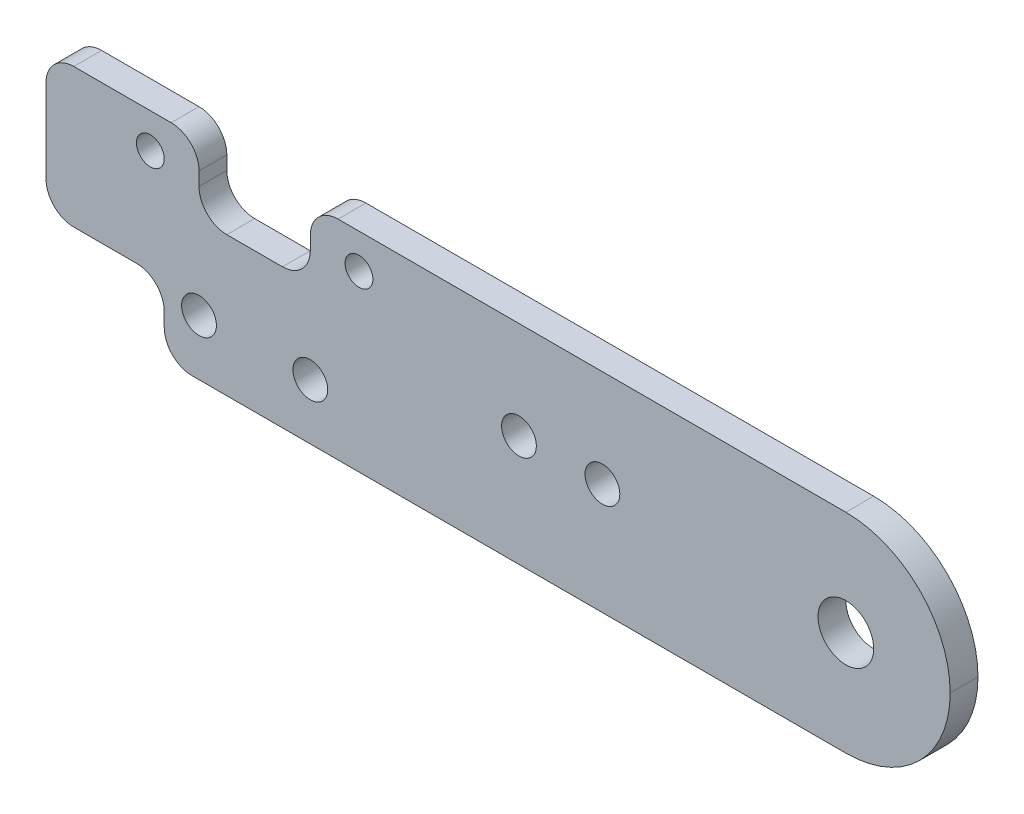
ISO-10303-21;
HEADER;
FILE_DESCRIPTION(('STEP AP214'),'2;1');
FILE_NAME('part.step','',(''),(''),'','','');
FILE_SCHEMA(('AUTOMOTIVE_DESIGN { 1 0 10303 214 1 1 1 1 }'));
ENDSEC;
DATA;
#1=APPLICATION_CONTEXT('core data for automotive mechanical design processes');
#2=APPLICATION_PROTOCOL_DEFINITION('international standard','automotive_design',2000,#1);
#3=PRODUCT_CONTEXT('',#1,'mechanical');
#4=PRODUCT('Part','Part','',(#3));
#5=PRODUCT_RELATED_PRODUCT_CATEGORY('part','',(#4));
#6=PRODUCT_DEFINITION_FORMATION('','',#4);
#7=PRODUCT_DEFINITION_CONTEXT('part definition',#1,'design');
#8=PRODUCT_DEFINITION('design','',#6,#7);
#9=PRODUCT_DEFINITION_SHAPE('','',#8);
#10=(LENGTH_UNIT() NAMED_UNIT(*) SI_UNIT(.MILLI.,.METRE.));
#11=(NAMED_UNIT(*) PLANE_ANGLE_UNIT() SI_UNIT($,.RADIAN.));
#12=(NAMED_UNIT(*) SI_UNIT($,.STERADIAN.) SOLID_ANGLE_UNIT());
#13=UNCERTAINTY_MEASURE_WITH_UNIT(LENGTH_MEASURE(1.E-05),#10,'distance_accuracy_value','');
#14=(GEOMETRIC_REPRESENTATION_CONTEXT(3) GLOBAL_UNCERTAINTY_ASSIGNED_CONTEXT((#13)) GLOBAL_UNIT_ASSIGNED_CONTEXT((#10,
#11,#12)) REPRESENTATION_CONTEXT('',''));
#15=CARTESIAN_POINT('',(0.,0.,0.));
#16=DIRECTION('',(0.,0.,1.));
#17=DIRECTION('',(1.,0.,0.));
#18=AXIS2_PLACEMENT_3D('',#15,#16,#17);
#19=CARTESIAN_POINT('',(-32.5,7.5,2.));
#20=DIRECTION('',(0.,-1.,0.));
#21=DIRECTION('',(0.,0.,-1.));
#22=AXIS2_PLACEMENT_3D('',#19,#20,#21);
#23=PLANE('',#22);
#24=DIRECTION('',(-1.,0.,0.));
#25=VECTOR('',#24,1.);
#26=CARTESIAN_POINT('',(-32.5,7.5,2.));
#27=LINE('',#26,#25);
#28=CARTESIAN_POINT('',(-23.5,7.5,2.));
#29=VERTEX_POINT('',#28);
#30=CARTESIAN_POINT('',(-30.5,7.5,2.));
#31=VERTEX_POINT('',#30);
#32=EDGE_CURVE('E203',#29,#31,#27,.T.);
#33=ORIENTED_EDGE('',*,*,#32,.F.);
#34=DIRECTION('',(0.,0.,1.));
#35=VECTOR('',#34,1.);
#36=CARTESIAN_POINT('',(-23.5,7.5,2.));
#37=LINE('',#36,#35);
#38=CARTESIAN_POINT('',(-23.5,7.5,0.));
#39=VERTEX_POINT('',#38);
#40=EDGE_CURVE('E297',#29,#39,#37,.F.);
#41=ORIENTED_EDGE('',*,*,#40,.T.);
#42=DIRECTION('',(-1.,0.,0.));
#43=VECTOR('',#42,1.);
#44=CARTESIAN_POINT('',(-32.5,7.5,0.));
#45=LINE('',#44,#43);
#46=CARTESIAN_POINT('',(-30.5,7.5,0.));
#47=VERTEX_POINT('',#46);
#48=EDGE_CURVE('E194',#39,#47,#45,.T.);
#49=ORIENTED_EDGE('',*,*,#48,.T.);
#50=DIRECTION('',(0.,0.,-1.));
#51=VECTOR('',#50,1.);
#52=CARTESIAN_POINT('',(-30.5,7.5,2.));
#53=LINE('',#52,#51);
#54=EDGE_CURVE('E295',#47,#31,#53,.F.);
#55=ORIENTED_EDGE('',*,*,#54,.T.);
#56=EDGE_LOOP('',(#33,#41,#49,#55));
#57=FACE_BOUND('',#56,.T.);
#58=ADVANCED_FACE('F36',(#57),#23,.F.);
#59=CARTESIAN_POINT('',(25.,7.5,0.));
#60=VERTEX_POINT('',#59);
#61=CARTESIAN_POINT('',(-11.5,7.5,0.));
#62=VERTEX_POINT('',#61);
#63=EDGE_CURVE('E184',#60,#62,#45,.T.);
#64=ORIENTED_EDGE('',*,*,#63,.T.);
#65=DIRECTION('',(0.,0.,1.));
#66=VECTOR('',#65,1.);
#67=CARTESIAN_POINT('',(-11.5,7.5,2.));
#68=LINE('',#67,#66);
#69=CARTESIAN_POINT('',(-11.5,7.5,2.));
#70=VERTEX_POINT('',#69);
#71=EDGE_CURVE('E288',#62,#70,#68,.T.);
#72=ORIENTED_EDGE('',*,*,#71,.T.);
#73=CARTESIAN_POINT('',(25.,7.5,2.));
#74=VERTEX_POINT('',#73);
#75=EDGE_CURVE('E187',#74,#70,#27,.T.);
#76=ORIENTED_EDGE('',*,*,#75,.F.);
#77=DIRECTION('',(0.,0.,-1.));
#78=VECTOR('',#77,1.);
#79=CARTESIAN_POINT('',(25.,7.5,2.));
#80=LINE('',#79,#78);
#81=EDGE_CURVE('E172',#74,#60,#80,.T.);
#82=ORIENTED_EDGE('',*,*,#81,.T.);
#83=EDGE_LOOP('',(#64,#72,#76,#82));
#84=FACE_BOUND('',#83,.T.);
#85=ADVANCED_FACE('F182',(#84),#23,.F.);
#86=CARTESIAN_POINT('',(-32.5,-7.5,2.));
#87=DIRECTION('',(1.,0.,0.));
#88=DIRECTION('',(0.,0.,-1.));
#89=AXIS2_PLACEMENT_3D('',#86,#87,#88);
#90=PLANE('',#89);
#91=DIRECTION('',(0.,-1.,0.));
#92=VECTOR('',#91,1.);
#93=CARTESIAN_POINT('',(-32.5,-7.5,0.));
#94=LINE('',#93,#92);
#95=CARTESIAN_POINT('',(-32.5,5.5,0.));
#96=VERTEX_POINT('',#95);
#97=CARTESIAN_POINT('',(-32.5,-0.5,0.));
#98=VERTEX_POINT('',#97);
#99=EDGE_CURVE('E193',#96,#98,#94,.T.);
#100=ORIENTED_EDGE('',*,*,#99,.T.);
#101=DIRECTION('',(0.,0.,1.));
#102=VECTOR('',#101,1.);
#103=CARTESIAN_POINT('',(-32.5,-0.5,2.));
#104=LINE('',#103,#102);
#105=CARTESIAN_POINT('',(-32.5,-0.5,2.));
#106=VERTEX_POINT('',#105);
#107=EDGE_CURVE('E275',#98,#106,#104,.T.);
#108=ORIENTED_EDGE('',*,*,#107,.T.);
#109=DIRECTION('',(0.,-1.,0.));
#110=VECTOR('',#109,1.);
#111=CARTESIAN_POINT('',(-32.5,-7.5,2.));
#112=LINE('',#111,#110);
#113=CARTESIAN_POINT('',(-32.5,5.5,2.));
#114=VERTEX_POINT('',#113);
#115=EDGE_CURVE('E362',#114,#106,#112,.T.);
#116=ORIENTED_EDGE('',*,*,#115,.F.);
#117=DIRECTION('',(0.,0.,-1.));
#118=VECTOR('',#117,1.);
#119=CARTESIAN_POINT('',(-32.5,5.5,2.));
#120=LINE('',#119,#118);
#121=EDGE_CURVE('E272',#114,#96,#120,.T.);
#122=ORIENTED_EDGE('',*,*,#121,.T.);
#123=EDGE_LOOP('',(#100,#108,#116,#122));
#124=FACE_BOUND('',#123,.T.);
#125=ADVANCED_FACE('F406',(#124),#90,.F.);
#126=CARTESIAN_POINT('',(-32.5,-7.5,2.));
#127=DIRECTION('',(0.,1.,0.));
#128=DIRECTION('',(0.,0.,1.));
#129=AXIS2_PLACEMENT_3D('',#126,#127,#128);
#130=PLANE('',#129);
#131=DIRECTION('',(1.,0.,0.));
#132=VECTOR('',#131,1.);
#133=CARTESIAN_POINT('',(-32.5,-7.5,2.));
#134=LINE('',#133,#132);
#135=CARTESIAN_POINT('',(-22.,-7.5,2.));
#136=VERTEX_POINT('',#135);
#137=CARTESIAN_POINT('',(25.,-7.5,2.));
#138=VERTEX_POINT('',#137);
#139=EDGE_CURVE('E188',#136,#138,#134,.T.);
#140=ORIENTED_EDGE('',*,*,#139,.F.);
#141=DIRECTION('',(0.,0.,1.));
#142=VECTOR('',#141,1.);
#143=CARTESIAN_POINT('',(-22.,-7.5,2.));
#144=LINE('',#143,#142);
#145=CARTESIAN_POINT('',(-22.,-7.5,0.));
#146=VERTEX_POINT('',#145);
#147=EDGE_CURVE('E261',#136,#146,#144,.F.);
#148=ORIENTED_EDGE('',*,*,#147,.T.);
#149=DIRECTION('',(1.,0.,0.));
#150=VECTOR('',#149,1.);
#151=CARTESIAN_POINT('',(-32.5,-7.5,0.));
#152=LINE('',#151,#150);
#153=CARTESIAN_POINT('',(25.,-7.5,0.));
#154=VERTEX_POINT('',#153);
#155=EDGE_CURVE('E197',#146,#154,#152,.T.);
#156=ORIENTED_EDGE('',*,*,#155,.T.);
#157=DIRECTION('',(0.,0.,-1.));
#158=VECTOR('',#157,1.);
#159=CARTESIAN_POINT('',(25.,-7.5,2.));
#160=LINE('',#159,#158);
#161=EDGE_CURVE('E209',#154,#138,#160,.F.);
#162=ORIENTED_EDGE('',*,*,#161,.T.);
#163=EDGE_LOOP('',(#140,#148,#156,#162));
#164=FACE_BOUND('',#163,.T.);
#165=ADVANCED_FACE('F370',(#164),#130,.F.);
#166=CARTESIAN_POINT('',(0.,0.,2.));
#167=DIRECTION('',(0.,0.,-1.));
#168=DIRECTION('',(-1.,0.,0.));
#169=AXIS2_PLACEMENT_3D('',#166,#167,#168);
#170=PLANE('',#169);
#171=CARTESIAN_POINT('',(1.50000000000001,0.5,2.));
#172=DIRECTION('',(0.,0.,1.));
#173=DIRECTION('',(1.,0.,0.));
#174=AXIS2_PLACEMENT_3D('',#171,#172,#173);
#175=CIRCLE('',#174,1.25);
#176=CARTESIAN_POINT('',(2.75000000000001,0.5,2.));
#177=VERTEX_POINT('',#176);
#178=EDGE_CURVE('E233',#177,#177,#175,.T.);
#179=ORIENTED_EDGE('',*,*,#178,.F.);
#180=EDGE_LOOP('',(#179));
#181=FACE_BOUND('',#180,.T.);
#182=CARTESIAN_POINT('',(7.50000000000001,0.5,2.));
#183=DIRECTION('',(0.,0.,1.));
#184=DIRECTION('',(1.,0.,0.));
#185=AXIS2_PLACEMENT_3D('',#182,#183,#184);
#186=CIRCLE('',#185,1.25);
#187=CARTESIAN_POINT('',(8.75000000000001,0.5,2.));
#188=VERTEX_POINT('',#187);
#189=EDGE_CURVE('E229',#188,#188,#186,.T.);
#190=ORIENTED_EDGE('',*,*,#189,.F.);
#191=EDGE_LOOP('',(#190));
#192=FACE_BOUND('',#191,.T.);
#193=CARTESIAN_POINT('',(-13.5,-3.5,2.));
#194=DIRECTION('',(0.,0.,-1.));
#195=DIRECTION('',(-1.,0.,0.));
#196=AXIS2_PLACEMENT_3D('',#193,#194,#195);
#197=CIRCLE('',#196,1.25);
#198=CARTESIAN_POINT('',(-14.75,-3.5,2.));
#199=VERTEX_POINT('',#198);
#200=EDGE_CURVE('E346',#199,#199,#197,.T.);
#201=ORIENTED_EDGE('',*,*,#200,.T.);
#202=EDGE_LOOP('',(#201));
#203=FACE_BOUND('',#202,.T.);
#204=CARTESIAN_POINT('',(-21.5,-3.5,2.));
#205=DIRECTION('',(0.,0.,-1.));
#206=DIRECTION('',(-1.,0.,0.));
#207=AXIS2_PLACEMENT_3D('',#204,#205,#206);
#208=CIRCLE('',#207,1.25);
#209=CARTESIAN_POINT('',(-22.75,-3.5,2.));
#210=VERTEX_POINT('',#209);
#211=EDGE_CURVE('E352',#210,#210,#208,.T.);
#212=ORIENTED_EDGE('',*,*,#211,.T.);
#213=EDGE_LOOP('',(#212));
#214=FACE_BOUND('',#213,.T.);
#215=CARTESIAN_POINT('',(-25.,5.,2.));
#216=DIRECTION('',(0.,0.,1.));
#217=DIRECTION('',(1.,0.,0.));
#218=AXIS2_PLACEMENT_3D('',#215,#216,#217);
#219=CIRCLE('',#218,0.999999999999998);
#220=CARTESIAN_POINT('',(-24.,5.,2.));
#221=VERTEX_POINT('',#220);
#222=EDGE_CURVE('E222',#221,#221,#219,.T.);
#223=ORIENTED_EDGE('',*,*,#222,.F.);
#224=EDGE_LOOP('',(#223));
#225=FACE_BOUND('',#224,.T.);
#226=CARTESIAN_POINT('',(-9.99999999999999,5.,2.));
#227=DIRECTION('',(0.,0.,1.));
#228=DIRECTION('',(1.,0.,0.));
#229=AXIS2_PLACEMENT_3D('',#226,#227,#228);
#230=CIRCLE('',#229,1.);
#231=CARTESIAN_POINT('',(-9.,5.,2.));
#232=VERTEX_POINT('',#231);
#233=EDGE_CURVE('E355',#232,#232,#230,.T.);
#234=ORIENTED_EDGE('',*,*,#233,.F.);
#235=EDGE_LOOP('',(#234));
#236=FACE_BOUND('',#235,.T.);
#237=CARTESIAN_POINT('',(25.,0.,2.));
#238=DIRECTION('',(0.,0.,1.));
#239=DIRECTION('',(1.,0.,0.));
#240=AXIS2_PLACEMENT_3D('',#237,#238,#239);
#241=CIRCLE('',#240,2.);
#242=CARTESIAN_POINT('',(27.,0.,2.));
#243=VERTEX_POINT('',#242);
#244=EDGE_CURVE('E217',#243,#243,#241,.T.);
#245=ORIENTED_EDGE('',*,*,#244,.F.);
#246=EDGE_LOOP('',(#245));
#247=FACE_BOUND('',#246,.T.);
#248=DIRECTION('',(0.,1.,0.));
#249=VECTOR('',#248,1.);
#250=CARTESIAN_POINT('',(-24.,-7.5,2.));
#251=LINE('',#250,#249);
#252=CARTESIAN_POINT('',(-24.,-5.5,2.));
#253=VERTEX_POINT('',#252);
#254=CARTESIAN_POINT('',(-24.,-4.5,2.));
#255=VERTEX_POINT('',#254);
#256=EDGE_CURVE('E382',#253,#255,#251,.T.);
#257=ORIENTED_EDGE('',*,*,#256,.F.);
#258=CARTESIAN_POINT('',(-22.,-5.5,2.));
#259=DIRECTION('',(0.,0.,-1.));
#260=DIRECTION('',(-1.,0.,0.));
#261=AXIS2_PLACEMENT_3D('',#258,#259,#260);
#262=CIRCLE('',#261,2.);
#263=EDGE_CURVE('E259',#253,#136,#262,.F.);
#264=ORIENTED_EDGE('',*,*,#263,.T.);
#265=ORIENTED_EDGE('',*,*,#139,.T.);
#266=CARTESIAN_POINT('',(25.,0.,2.));
#267=DIRECTION('',(0.,0.,-1.));
#268=DIRECTION('',(-1.,0.,0.));
#269=AXIS2_PLACEMENT_3D('',#266,#267,#268);
#270=CIRCLE('',#269,7.5);
#271=CARTESIAN_POINT('',(32.5,0.,2.));
#272=VERTEX_POINT('',#271);
#273=EDGE_CURVE('E177',#138,#272,#270,.F.);
#274=ORIENTED_EDGE('',*,*,#273,.T.);
#275=CARTESIAN_POINT('',(25.,0.,2.));
#276=DIRECTION('',(0.,0.,-1.));
#277=DIRECTION('',(-1.,0.,0.));
#278=AXIS2_PLACEMENT_3D('',#275,#276,#277);
#279=CIRCLE('',#278,7.5);
#280=EDGE_CURVE('E207',#272,#74,#279,.F.);
#281=ORIENTED_EDGE('',*,*,#280,.T.);
#282=ORIENTED_EDGE('',*,*,#75,.T.);
#283=CARTESIAN_POINT('',(-11.5,5.5,2.));
#284=DIRECTION('',(0.,0.,-1.));
#285=DIRECTION('',(-1.,0.,0.));
#286=AXIS2_PLACEMENT_3D('',#283,#284,#285);
#287=CIRCLE('',#286,2.);
#288=CARTESIAN_POINT('',(-13.5,5.5,2.));
#289=VERTEX_POINT('',#288);
#290=EDGE_CURVE('E255',#70,#289,#287,.F.);
#291=ORIENTED_EDGE('',*,*,#290,.T.);
#292=DIRECTION('',(0.,1.,0.));
#293=VECTOR('',#292,1.);
#294=CARTESIAN_POINT('',(-13.5,7.5,2.));
#295=LINE('',#294,#293);
#296=CARTESIAN_POINT('',(-13.5,4.52974123754762,2.));
#297=VERTEX_POINT('',#296);
#298=EDGE_CURVE('E335',#297,#289,#295,.T.);
#299=ORIENTED_EDGE('',*,*,#298,.F.);
#300=CARTESIAN_POINT('',(-15.5,4.52974123754762,2.));
#301=DIRECTION('',(0.,0.,-1.));
#302=DIRECTION('',(-1.,0.,0.));
#303=AXIS2_PLACEMENT_3D('',#300,#301,#302);
#304=CIRCLE('',#303,2.);
#305=CARTESIAN_POINT('',(-15.5,2.52974123754762,2.));
#306=VERTEX_POINT('',#305);
#307=EDGE_CURVE('E303',#297,#306,#304,.T.);
#308=ORIENTED_EDGE('',*,*,#307,.T.);
#309=DIRECTION('',(1.,0.,0.));
#310=VECTOR('',#309,1.);
#311=CARTESIAN_POINT('',(-21.5,2.52974123754762,2.));
#312=LINE('',#311,#310);
#313=CARTESIAN_POINT('',(-19.5,2.52974123754762,2.));
#314=VERTEX_POINT('',#313);
#315=EDGE_CURVE('E313',#314,#306,#312,.T.);
#316=ORIENTED_EDGE('',*,*,#315,.F.);
#317=CARTESIAN_POINT('',(-19.5,4.52974123754762,2.));
#318=DIRECTION('',(0.,0.,-1.));
#319=DIRECTION('',(-1.,0.,0.));
#320=AXIS2_PLACEMENT_3D('',#317,#318,#319);
#321=CIRCLE('',#320,2.);
#322=CARTESIAN_POINT('',(-21.5,4.52974123754762,2.));
#323=VERTEX_POINT('',#322);
#324=EDGE_CURVE('E44',#314,#323,#321,.T.);
#325=ORIENTED_EDGE('',*,*,#324,.T.);
#326=DIRECTION('',(0.,-1.,0.));
#327=VECTOR('',#326,1.);
#328=CARTESIAN_POINT('',(-21.5,7.5,2.));
#329=LINE('',#328,#327);
#330=CARTESIAN_POINT('',(-21.5,5.5,2.));
#331=VERTEX_POINT('',#330);
#332=EDGE_CURVE('E311',#331,#323,#329,.T.);
#333=ORIENTED_EDGE('',*,*,#332,.F.);
#334=CARTESIAN_POINT('',(-23.5,5.5,2.));
#335=DIRECTION('',(0.,0.,-1.));
#336=DIRECTION('',(-1.,0.,0.));
#337=AXIS2_PLACEMENT_3D('',#334,#335,#336);
#338=CIRCLE('',#337,2.);
#339=EDGE_CURVE('E253',#331,#29,#338,.F.);
#340=ORIENTED_EDGE('',*,*,#339,.T.);
#341=ORIENTED_EDGE('',*,*,#32,.T.);
#342=CARTESIAN_POINT('',(-30.5,5.5,2.));
#343=DIRECTION('',(0.,0.,-1.));
#344=DIRECTION('',(-1.,0.,0.));
#345=AXIS2_PLACEMENT_3D('',#342,#343,#344);
#346=CIRCLE('',#345,2.);
#347=EDGE_CURVE('E251',#31,#114,#346,.F.);
#348=ORIENTED_EDGE('',*,*,#347,.T.);
#349=ORIENTED_EDGE('',*,*,#115,.T.);
#350=CARTESIAN_POINT('',(-30.5,-0.5,2.));
#351=DIRECTION('',(0.,0.,-1.));
#352=DIRECTION('',(-1.,0.,0.));
#353=AXIS2_PLACEMENT_3D('',#350,#351,#352);
#354=CIRCLE('',#353,2.);
#355=CARTESIAN_POINT('',(-30.5,-2.5,2.));
#356=VERTEX_POINT('',#355);
#357=EDGE_CURVE('E257',#106,#356,#354,.F.);
#358=ORIENTED_EDGE('',*,*,#357,.T.);
#359=DIRECTION('',(-1.,0.,0.));
#360=VECTOR('',#359,1.);
#361=CARTESIAN_POINT('',(-32.5,-2.5,2.));
#362=LINE('',#361,#360);
#363=CARTESIAN_POINT('',(-26.,-2.5,2.));
#364=VERTEX_POINT('',#363);
#365=EDGE_CURVE('E386',#364,#356,#362,.T.);
#366=ORIENTED_EDGE('',*,*,#365,.F.);
#367=CARTESIAN_POINT('',(-26.,-4.5,2.));
#368=DIRECTION('',(0.,0.,-1.));
#369=DIRECTION('',(-1.,0.,0.));
#370=AXIS2_PLACEMENT_3D('',#367,#368,#369);
#371=CIRCLE('',#370,2.);
#372=EDGE_CURVE('E299',#364,#255,#371,.T.);
#373=ORIENTED_EDGE('',*,*,#372,.T.);
#374=EDGE_LOOP('',(#257,#264,#265,#274,#281,#282,#291,#299,#308,#316,#325,#333,#340,#341,#348,
#349,#358,#366,#373));
#375=FACE_BOUND('',#374,.T.);
#376=ADVANCED_FACE('F310',(#181,#192,#203,#214,#225,#236,#247,#375),#170,.F.);
#377=CARTESIAN_POINT('',(0.,0.,0.));
#378=DIRECTION('',(0.,0.,-1.));
#379=DIRECTION('',(-1.,0.,0.));
#380=AXIS2_PLACEMENT_3D('',#377,#378,#379);
#381=PLANE('',#380);
#382=ORIENTED_EDGE('',*,*,#155,.F.);
#383=CARTESIAN_POINT('',(-22.,-5.5,0.));
#384=DIRECTION('',(0.,0.,-1.));
#385=DIRECTION('',(-1.,0.,0.));
#386=AXIS2_PLACEMENT_3D('',#383,#384,#385);
#387=CIRCLE('',#386,2.);
#388=CARTESIAN_POINT('',(-24.,-5.5,0.));
#389=VERTEX_POINT('',#388);
#390=EDGE_CURVE('E270',#146,#389,#387,.T.);
#391=ORIENTED_EDGE('',*,*,#390,.T.);
#392=DIRECTION('',(0.,1.,0.));
#393=VECTOR('',#392,1.);
#394=CARTESIAN_POINT('',(-24.,-7.5,0.));
#395=LINE('',#394,#393);
#396=CARTESIAN_POINT('',(-24.,-4.5,0.));
#397=VERTEX_POINT('',#396);
#398=EDGE_CURVE('E384',#389,#397,#395,.T.);
#399=ORIENTED_EDGE('',*,*,#398,.T.);
#400=CARTESIAN_POINT('',(-26.,-4.5,0.));
#401=DIRECTION('',(0.,0.,-1.));
#402=DIRECTION('',(-1.,0.,0.));
#403=AXIS2_PLACEMENT_3D('',#400,#401,#402);
#404=CIRCLE('',#403,2.);
#405=CARTESIAN_POINT('',(-26.,-2.5,0.));
#406=VERTEX_POINT('',#405);
#407=EDGE_CURVE('E301',#397,#406,#404,.F.);
#408=ORIENTED_EDGE('',*,*,#407,.T.);
#409=DIRECTION('',(-1.,0.,0.));
#410=VECTOR('',#409,1.);
#411=CARTESIAN_POINT('',(-32.5,-2.5,0.));
#412=LINE('',#411,#410);
#413=CARTESIAN_POINT('',(-30.5,-2.5,0.));
#414=VERTEX_POINT('',#413);
#415=EDGE_CURVE('E321',#406,#414,#412,.T.);
#416=ORIENTED_EDGE('',*,*,#415,.T.);
#417=CARTESIAN_POINT('',(-30.5,-0.5,0.));
#418=DIRECTION('',(0.,0.,-1.));
#419=DIRECTION('',(-1.,0.,0.));
#420=AXIS2_PLACEMENT_3D('',#417,#418,#419);
#421=CIRCLE('',#420,2.);
#422=EDGE_CURVE('E268',#414,#98,#421,.T.);
#423=ORIENTED_EDGE('',*,*,#422,.T.);
#424=ORIENTED_EDGE('',*,*,#99,.F.);
#425=CARTESIAN_POINT('',(-30.5,5.5,0.));
#426=DIRECTION('',(0.,0.,-1.));
#427=DIRECTION('',(-1.,0.,0.));
#428=AXIS2_PLACEMENT_3D('',#425,#426,#427);
#429=CIRCLE('',#428,2.);
#430=EDGE_CURVE('E263',#96,#47,#429,.T.);
#431=ORIENTED_EDGE('',*,*,#430,.T.);
#432=ORIENTED_EDGE('',*,*,#48,.F.);
#433=CARTESIAN_POINT('',(-23.5,5.5,0.));
#434=DIRECTION('',(0.,0.,-1.));
#435=DIRECTION('',(-1.,0.,0.));
#436=AXIS2_PLACEMENT_3D('',#433,#434,#435);
#437=CIRCLE('',#436,2.);
#438=CARTESIAN_POINT('',(-21.5,5.5,0.));
#439=VERTEX_POINT('',#438);
#440=EDGE_CURVE('E265',#39,#439,#437,.T.);
#441=ORIENTED_EDGE('',*,*,#440,.T.);
#442=DIRECTION('',(0.,1.,0.));
#443=VECTOR('',#442,1.);
#444=CARTESIAN_POINT('',(-21.5,0.,0.));
#445=LINE('',#444,#443);
#446=CARTESIAN_POINT('',(-21.5,4.52974123754762,0.));
#447=VERTEX_POINT('',#446);
#448=EDGE_CURVE('E238',#447,#439,#445,.T.);
#449=ORIENTED_EDGE('',*,*,#448,.F.);
#450=CARTESIAN_POINT('',(-19.5,4.52974123754762,0.));
#451=DIRECTION('',(0.,0.,-1.));
#452=DIRECTION('',(-1.,0.,0.));
#453=AXIS2_PLACEMENT_3D('',#450,#451,#452);
#454=CIRCLE('',#453,2.);
#455=CARTESIAN_POINT('',(-19.5,2.52974123754762,0.));
#456=VERTEX_POINT('',#455);
#457=EDGE_CURVE('E11',#447,#456,#454,.F.);
#458=ORIENTED_EDGE('',*,*,#457,.T.);
#459=DIRECTION('',(-1.,0.,0.));
#460=VECTOR('',#459,1.);
#461=CARTESIAN_POINT('',(0.,2.52974123754762,0.));
#462=LINE('',#461,#460);
#463=CARTESIAN_POINT('',(-15.5,2.52974123754762,0.));
#464=VERTEX_POINT('',#463);
#465=EDGE_CURVE('E212',#464,#456,#462,.T.);
#466=ORIENTED_EDGE('',*,*,#465,.F.);
#467=CARTESIAN_POINT('',(-15.5,4.52974123754762,0.));
#468=DIRECTION('',(0.,0.,-1.));
#469=DIRECTION('',(-1.,0.,0.));
#470=AXIS2_PLACEMENT_3D('',#467,#468,#469);
#471=CIRCLE('',#470,2.);
#472=CARTESIAN_POINT('',(-13.5,4.52974123754762,0.));
#473=VERTEX_POINT('',#472);
#474=EDGE_CURVE('E57',#464,#473,#471,.F.);
#475=ORIENTED_EDGE('',*,*,#474,.T.);
#476=DIRECTION('',(0.,-1.,0.));
#477=VECTOR('',#476,1.);
#478=CARTESIAN_POINT('',(-13.5,0.,0.));
#479=LINE('',#478,#477);
#480=CARTESIAN_POINT('',(-13.5,5.5,0.));
#481=VERTEX_POINT('',#480);
#482=EDGE_CURVE('E236',#481,#473,#479,.T.);
#483=ORIENTED_EDGE('',*,*,#482,.F.);
#484=CARTESIAN_POINT('',(-11.5,5.5,0.));
#485=DIRECTION('',(0.,0.,-1.));
#486=DIRECTION('',(-1.,0.,0.));
#487=AXIS2_PLACEMENT_3D('',#484,#485,#486);
#488=CIRCLE('',#487,2.);
#489=EDGE_CURVE('E51',#481,#62,#488,.T.);
#490=ORIENTED_EDGE('',*,*,#489,.T.);
#491=ORIENTED_EDGE('',*,*,#63,.F.);
#492=CARTESIAN_POINT('',(25.,0.,0.));
#493=DIRECTION('',(0.,0.,-1.));
#494=DIRECTION('',(-1.,0.,0.));
#495=AXIS2_PLACEMENT_3D('',#492,#493,#494);
#496=CIRCLE('',#495,7.5);
#497=CARTESIAN_POINT('',(32.5,0.,0.));
#498=VERTEX_POINT('',#497);
#499=EDGE_CURVE('E168',#60,#498,#496,.T.);
#500=ORIENTED_EDGE('',*,*,#499,.T.);
#501=CARTESIAN_POINT('',(25.,0.,0.));
#502=DIRECTION('',(0.,0.,-1.));
#503=DIRECTION('',(-1.,0.,0.));
#504=AXIS2_PLACEMENT_3D('',#501,#502,#503);
#505=CIRCLE('',#504,7.5);
#506=EDGE_CURVE('E178',#498,#154,#505,.T.);
#507=ORIENTED_EDGE('',*,*,#506,.T.);
#508=EDGE_LOOP('',(#382,#391,#399,#408,#416,#423,#424,#431,#432,#441,#449,#458,#466,#475,#483,
#490,#491,#500,#507));
#509=FACE_BOUND('',#508,.T.);
#510=CARTESIAN_POINT('',(1.50000000000001,0.5,0.));
#511=DIRECTION('',(0.,0.,-1.));
#512=DIRECTION('',(-1.,0.,0.));
#513=AXIS2_PLACEMENT_3D('',#510,#511,#512);
#514=CIRCLE('',#513,1.25);
#515=CARTESIAN_POINT('',(0.250000000000007,0.5,0.));
#516=VERTEX_POINT('',#515);
#517=EDGE_CURVE('E230',#516,#516,#514,.T.);
#518=ORIENTED_EDGE('',*,*,#517,.F.);
#519=EDGE_LOOP('',(#518));
#520=FACE_BOUND('',#519,.T.);
#521=CARTESIAN_POINT('',(7.50000000000001,0.5,0.));
#522=DIRECTION('',(0.,0.,-1.));
#523=DIRECTION('',(-1.,0.,0.));
#524=AXIS2_PLACEMENT_3D('',#521,#522,#523);
#525=CIRCLE('',#524,1.25);
#526=CARTESIAN_POINT('',(6.25000000000001,0.5,0.));
#527=VERTEX_POINT('',#526);
#528=EDGE_CURVE('E225',#527,#527,#525,.T.);
#529=ORIENTED_EDGE('',*,*,#528,.F.);
#530=EDGE_LOOP('',(#529));
#531=FACE_BOUND('',#530,.T.);
#532=CARTESIAN_POINT('',(-13.5,-3.5,0.));
#533=DIRECTION('',(0.,0.,-1.));
#534=DIRECTION('',(-1.,0.,0.));
#535=AXIS2_PLACEMENT_3D('',#532,#533,#534);
#536=CIRCLE('',#535,1.25);
#537=CARTESIAN_POINT('',(-14.75,-3.5,0.));
#538=VERTEX_POINT('',#537);
#539=EDGE_CURVE('E228',#538,#538,#536,.T.);
#540=ORIENTED_EDGE('',*,*,#539,.F.);
#541=EDGE_LOOP('',(#540));
#542=FACE_BOUND('',#541,.T.);
#543=CARTESIAN_POINT('',(-21.5,-3.5,0.));
#544=DIRECTION('',(0.,0.,-1.));
#545=DIRECTION('',(-1.,0.,0.));
#546=AXIS2_PLACEMENT_3D('',#543,#544,#545);
#547=CIRCLE('',#546,1.25);
#548=CARTESIAN_POINT('',(-22.75,-3.5,0.));
#549=VERTEX_POINT('',#548);
#550=EDGE_CURVE('E349',#549,#549,#547,.T.);
#551=ORIENTED_EDGE('',*,*,#550,.F.);
#552=EDGE_LOOP('',(#551));
#553=FACE_BOUND('',#552,.T.);
#554=CARTESIAN_POINT('',(-25.,5.,0.));
#555=DIRECTION('',(0.,0.,-1.));
#556=DIRECTION('',(-1.,0.,0.));
#557=AXIS2_PLACEMENT_3D('',#554,#555,#556);
#558=CIRCLE('',#557,0.999999999999998);
#559=CARTESIAN_POINT('',(-26.,5.,0.));
#560=VERTEX_POINT('',#559);
#561=EDGE_CURVE('E221',#560,#560,#558,.T.);
#562=ORIENTED_EDGE('',*,*,#561,.F.);
#563=EDGE_LOOP('',(#562));
#564=FACE_BOUND('',#563,.T.);
#565=CARTESIAN_POINT('',(-9.99999999999999,5.,0.));
#566=DIRECTION('',(0.,0.,-1.));
#567=DIRECTION('',(-1.,0.,0.));
#568=AXIS2_PLACEMENT_3D('',#565,#566,#567);
#569=CIRCLE('',#568,1.);
#570=CARTESIAN_POINT('',(-11.,5.,0.));
#571=VERTEX_POINT('',#570);
#572=EDGE_CURVE('E218',#571,#571,#569,.T.);
#573=ORIENTED_EDGE('',*,*,#572,.F.);
#574=EDGE_LOOP('',(#573));
#575=FACE_BOUND('',#574,.T.);
#576=CARTESIAN_POINT('',(25.,0.,0.));
#577=DIRECTION('',(0.,0.,-1.));
#578=DIRECTION('',(-1.,0.,0.));
#579=AXIS2_PLACEMENT_3D('',#576,#577,#578);
#580=CIRCLE('',#579,2.);
#581=CARTESIAN_POINT('',(23.,0.,0.));
#582=VERTEX_POINT('',#581);
#583=EDGE_CURVE('E214',#582,#582,#580,.T.);
#584=ORIENTED_EDGE('',*,*,#583,.F.);
#585=EDGE_LOOP('',(#584));
#586=FACE_BOUND('',#585,.T.);
#587=ADVANCED_FACE('F191',(#509,#520,#531,#542,#553,#564,#575,#586),#381,.T.);
#588=CARTESIAN_POINT('',(25.,0.,2.));
#589=DIRECTION('',(0.,0.,-1.));
#590=DIRECTION('',(-1.,0.,0.));
#591=AXIS2_PLACEMENT_3D('',#588,#589,#590);
#592=CYLINDRICAL_SURFACE('',#591,7.5);
#593=DIRECTION('',(0.,0.,-1.));
#594=VECTOR('',#593,1.);
#595=CARTESIAN_POINT('',(32.5,0.,2.));
#596=LINE('',#595,#594);
#597=EDGE_CURVE('E174',#272,#498,#596,.T.);
#598=ORIENTED_EDGE('',*,*,#597,.F.);
#599=ORIENTED_EDGE('',*,*,#273,.F.);
#600=ORIENTED_EDGE('',*,*,#161,.F.);
#601=ORIENTED_EDGE('',*,*,#506,.F.);
#602=EDGE_LOOP('',(#598,#599,#600,#601));
#603=FACE_BOUND('',#602,.T.);
#604=ADVANCED_FACE('F372',(#603),#592,.T.);
#605=CARTESIAN_POINT('',(25.,0.,2.));
#606=DIRECTION('',(0.,0.,-1.));
#607=DIRECTION('',(-1.,0.,0.));
#608=AXIS2_PLACEMENT_3D('',#605,#606,#607);
#609=CYLINDRICAL_SURFACE('',#608,7.5);
#610=ORIENTED_EDGE('',*,*,#280,.F.);
#611=ORIENTED_EDGE('',*,*,#597,.T.);
#612=ORIENTED_EDGE('',*,*,#499,.F.);
#613=ORIENTED_EDGE('',*,*,#81,.F.);
#614=EDGE_LOOP('',(#610,#611,#612,#613));
#615=FACE_BOUND('',#614,.T.);
#616=ADVANCED_FACE('F171',(#615),#609,.T.);
#617=CARTESIAN_POINT('',(25.,0.,-8.));
#618=DIRECTION('',(0.,0.,1.));
#619=DIRECTION('',(1.,0.,0.));
#620=AXIS2_PLACEMENT_3D('',#617,#618,#619);
#621=CYLINDRICAL_SURFACE('',#620,2.);
#622=ORIENTED_EDGE('',*,*,#583,.T.);
#623=EDGE_LOOP('',(#622));
#624=FACE_BOUND('',#623,.T.);
#625=ORIENTED_EDGE('',*,*,#244,.T.);
#626=EDGE_LOOP('',(#625));
#627=FACE_BOUND('',#626,.T.);
#628=ADVANCED_FACE('F439',(#624,#627),#621,.F.);
#629=CARTESIAN_POINT('',(-9.99999999999999,5.,-8.));
#630=DIRECTION('',(0.,0.,1.));
#631=DIRECTION('',(1.,0.,0.));
#632=AXIS2_PLACEMENT_3D('',#629,#630,#631);
#633=CYLINDRICAL_SURFACE('',#632,1.);
#634=ORIENTED_EDGE('',*,*,#572,.T.);
#635=EDGE_LOOP('',(#634));
#636=FACE_BOUND('',#635,.T.);
#637=ORIENTED_EDGE('',*,*,#233,.T.);
#638=EDGE_LOOP('',(#637));
#639=FACE_BOUND('',#638,.T.);
#640=ADVANCED_FACE('F578',(#636,#639),#633,.F.);
#641=CARTESIAN_POINT('',(-25.,5.,-8.));
#642=DIRECTION('',(0.,0.,1.));
#643=DIRECTION('',(1.,0.,0.));
#644=AXIS2_PLACEMENT_3D('',#641,#642,#643);
#645=CYLINDRICAL_SURFACE('',#644,0.999999999999998);
#646=ORIENTED_EDGE('',*,*,#561,.T.);
#647=EDGE_LOOP('',(#646));
#648=FACE_BOUND('',#647,.T.);
#649=ORIENTED_EDGE('',*,*,#222,.T.);
#650=EDGE_LOOP('',(#649));
#651=FACE_BOUND('',#650,.T.);
#652=ADVANCED_FACE('F569',(#648,#651),#645,.F.);
#653=CARTESIAN_POINT('',(-21.5,-3.5,10.));
#654=DIRECTION('',(0.,0.,-1.));
#655=DIRECTION('',(-1.,0.,0.));
#656=AXIS2_PLACEMENT_3D('',#653,#654,#655);
#657=CYLINDRICAL_SURFACE('',#656,1.25);
#658=ORIENTED_EDGE('',*,*,#550,.T.);
#659=EDGE_LOOP('',(#658));
#660=FACE_BOUND('',#659,.T.);
#661=ORIENTED_EDGE('',*,*,#211,.F.);
#662=EDGE_LOOP('',(#661));
#663=FACE_BOUND('',#662,.T.);
#664=ADVANCED_FACE('F560',(#660,#663),#657,.F.);
#665=CARTESIAN_POINT('',(-13.5,-3.5,10.));
#666=DIRECTION('',(0.,0.,-1.));
#667=DIRECTION('',(-1.,0.,0.));
#668=AXIS2_PLACEMENT_3D('',#665,#666,#667);
#669=CYLINDRICAL_SURFACE('',#668,1.25);
#670=ORIENTED_EDGE('',*,*,#539,.T.);
#671=EDGE_LOOP('',(#670));
#672=FACE_BOUND('',#671,.T.);
#673=ORIENTED_EDGE('',*,*,#200,.F.);
#674=EDGE_LOOP('',(#673));
#675=FACE_BOUND('',#674,.T.);
#676=ADVANCED_FACE('F551',(#672,#675),#669,.F.);
#677=CARTESIAN_POINT('',(7.50000000000001,0.5,-8.));
#678=DIRECTION('',(0.,0.,1.));
#679=DIRECTION('',(1.,0.,0.));
#680=AXIS2_PLACEMENT_3D('',#677,#678,#679);
#681=CYLINDRICAL_SURFACE('',#680,1.25);
#682=ORIENTED_EDGE('',*,*,#528,.T.);
#683=EDGE_LOOP('',(#682));
#684=FACE_BOUND('',#683,.T.);
#685=ORIENTED_EDGE('',*,*,#189,.T.);
#686=EDGE_LOOP('',(#685));
#687=FACE_BOUND('',#686,.T.);
#688=ADVANCED_FACE('F542',(#684,#687),#681,.F.);
#689=CARTESIAN_POINT('',(1.50000000000001,0.5,-8.));
#690=DIRECTION('',(0.,0.,1.));
#691=DIRECTION('',(1.,0.,0.));
#692=AXIS2_PLACEMENT_3D('',#689,#690,#691);
#693=CYLINDRICAL_SURFACE('',#692,1.25);
#694=ORIENTED_EDGE('',*,*,#517,.T.);
#695=EDGE_LOOP('',(#694));
#696=FACE_BOUND('',#695,.T.);
#697=ORIENTED_EDGE('',*,*,#178,.T.);
#698=EDGE_LOOP('',(#697));
#699=FACE_BOUND('',#698,.T.);
#700=ADVANCED_FACE('F528',(#696,#699),#693,.F.);
#701=CARTESIAN_POINT('',(-21.5,7.5,-8.));
#702=DIRECTION('',(-1.,0.,0.));
#703=DIRECTION('',(0.,0.,1.));
#704=AXIS2_PLACEMENT_3D('',#701,#702,#703);
#705=PLANE('',#704);
#706=ORIENTED_EDGE('',*,*,#448,.T.);
#707=DIRECTION('',(0.,0.,1.));
#708=VECTOR('',#707,1.);
#709=CARTESIAN_POINT('',(-21.5,5.5,-8.));
#710=LINE('',#709,#708);
#711=EDGE_CURVE('E292',#439,#331,#710,.T.);
#712=ORIENTED_EDGE('',*,*,#711,.T.);
#713=ORIENTED_EDGE('',*,*,#332,.T.);
#714=DIRECTION('',(0.,0.,1.));
#715=VECTOR('',#714,1.);
#716=CARTESIAN_POINT('',(-21.5,4.52974123754762,0.));
#717=LINE('',#716,#715);
#718=EDGE_CURVE('E290',#323,#447,#717,.F.);
#719=ORIENTED_EDGE('',*,*,#718,.T.);
#720=EDGE_LOOP('',(#706,#712,#713,#719));
#721=FACE_BOUND('',#720,.T.);
#722=ADVANCED_FACE('F318',(#721),#705,.F.);
#723=CARTESIAN_POINT('',(-13.5,7.5,-8.));
#724=DIRECTION('',(1.,0.,0.));
#725=DIRECTION('',(0.,0.,-1.));
#726=AXIS2_PLACEMENT_3D('',#723,#724,#725);
#727=PLANE('',#726);
#728=ORIENTED_EDGE('',*,*,#482,.T.);
#729=DIRECTION('',(0.,0.,1.));
#730=VECTOR('',#729,1.);
#731=CARTESIAN_POINT('',(-13.5,4.52974123754762,2.));
#732=LINE('',#731,#730);
#733=EDGE_CURVE('E280',#473,#297,#732,.T.);
#734=ORIENTED_EDGE('',*,*,#733,.T.);
#735=ORIENTED_EDGE('',*,*,#298,.T.);
#736=DIRECTION('',(0.,0.,1.));
#737=VECTOR('',#736,1.);
#738=CARTESIAN_POINT('',(-13.5,5.5,-8.));
#739=LINE('',#738,#737);
#740=EDGE_CURVE('E278',#289,#481,#739,.F.);
#741=ORIENTED_EDGE('',*,*,#740,.T.);
#742=EDGE_LOOP('',(#728,#734,#735,#741));
#743=FACE_BOUND('',#742,.T.);
#744=ADVANCED_FACE('F334',(#743),#727,.F.);
#745=CARTESIAN_POINT('',(-21.5,2.52974123754762,-8.));
#746=DIRECTION('',(0.,-1.,0.));
#747=DIRECTION('',(0.,0.,-1.));
#748=AXIS2_PLACEMENT_3D('',#745,#746,#747);
#749=PLANE('',#748);
#750=ORIENTED_EDGE('',*,*,#315,.T.);
#751=DIRECTION('',(0.,0.,1.));
#752=VECTOR('',#751,1.);
#753=CARTESIAN_POINT('',(-15.5,2.52974123754762,0.));
#754=LINE('',#753,#752);
#755=EDGE_CURVE('E286',#306,#464,#754,.F.);
#756=ORIENTED_EDGE('',*,*,#755,.T.);
#757=ORIENTED_EDGE('',*,*,#465,.T.);
#758=DIRECTION('',(0.,0.,1.));
#759=VECTOR('',#758,1.);
#760=CARTESIAN_POINT('',(-19.5,2.52974123754762,2.));
#761=LINE('',#760,#759);
#762=EDGE_CURVE('E283',#456,#314,#761,.T.);
#763=ORIENTED_EDGE('',*,*,#762,.T.);
#764=EDGE_LOOP('',(#750,#756,#757,#763));
#765=FACE_BOUND('',#764,.T.);
#766=ADVANCED_FACE('F326',(#765),#749,.F.);
#767=CARTESIAN_POINT('',(-32.5,-2.5,0.));
#768=DIRECTION('',(0.,1.,0.));
#769=DIRECTION('',(0.,0.,1.));
#770=AXIS2_PLACEMENT_3D('',#767,#768,#769);
#771=PLANE('',#770);
#772=ORIENTED_EDGE('',*,*,#415,.F.);
#773=DIRECTION('',(0.,0.,1.));
#774=VECTOR('',#773,1.);
#775=CARTESIAN_POINT('',(-26.,-2.5,2.));
#776=LINE('',#775,#774);
#777=EDGE_CURVE('E243',#406,#364,#776,.T.);
#778=ORIENTED_EDGE('',*,*,#777,.T.);
#779=ORIENTED_EDGE('',*,*,#365,.T.);
#780=DIRECTION('',(0.,0.,1.));
#781=VECTOR('',#780,1.);
#782=CARTESIAN_POINT('',(-30.5,-2.5,0.));
#783=LINE('',#782,#781);
#784=EDGE_CURVE('E241',#356,#414,#783,.F.);
#785=ORIENTED_EDGE('',*,*,#784,.T.);
#786=EDGE_LOOP('',(#772,#778,#779,#785));
#787=FACE_BOUND('',#786,.T.);
#788=ADVANCED_FACE('F399',(#787),#771,.F.);
#789=CARTESIAN_POINT('',(-24.,-7.5,0.));
#790=DIRECTION('',(1.,0.,0.));
#791=DIRECTION('',(0.,0.,-1.));
#792=AXIS2_PLACEMENT_3D('',#789,#790,#791);
#793=PLANE('',#792);
#794=ORIENTED_EDGE('',*,*,#256,.T.);
#795=DIRECTION('',(0.,0.,1.));
#796=VECTOR('',#795,1.);
#797=CARTESIAN_POINT('',(-24.,-4.5,0.));
#798=LINE('',#797,#796);
#799=EDGE_CURVE('E249',#255,#397,#798,.F.);
#800=ORIENTED_EDGE('',*,*,#799,.T.);
#801=ORIENTED_EDGE('',*,*,#398,.F.);
#802=DIRECTION('',(0.,0.,1.));
#803=VECTOR('',#802,1.);
#804=CARTESIAN_POINT('',(-24.,-5.5,0.));
#805=LINE('',#804,#803);
#806=EDGE_CURVE('E246',#389,#253,#805,.T.);
#807=ORIENTED_EDGE('',*,*,#806,.T.);
#808=EDGE_LOOP('',(#794,#800,#801,#807));
#809=FACE_BOUND('',#808,.T.);
#810=ADVANCED_FACE('F381',(#809),#793,.F.);
#811=CARTESIAN_POINT('',(-26.,-4.5,0.));
#812=DIRECTION('',(0.,0.,-1.));
#813=DIRECTION('',(-1.,0.,0.));
#814=AXIS2_PLACEMENT_3D('',#811,#812,#813);
#815=CYLINDRICAL_SURFACE('',#814,2.);
#816=ORIENTED_EDGE('',*,*,#407,.F.);
#817=ORIENTED_EDGE('',*,*,#799,.F.);
#818=ORIENTED_EDGE('',*,*,#372,.F.);
#819=ORIENTED_EDGE('',*,*,#777,.F.);
#820=EDGE_LOOP('',(#816,#817,#818,#819));
#821=FACE_BOUND('',#820,.T.);
#822=ADVANCED_FACE('F397',(#821),#815,.F.);
#823=CARTESIAN_POINT('',(-22.,-5.5,0.));
#824=DIRECTION('',(0.,0.,1.));
#825=DIRECTION('',(1.,0.,0.));
#826=AXIS2_PLACEMENT_3D('',#823,#824,#825);
#827=CYLINDRICAL_SURFACE('',#826,2.);
#828=ORIENTED_EDGE('',*,*,#390,.F.);
#829=ORIENTED_EDGE('',*,*,#147,.F.);
#830=ORIENTED_EDGE('',*,*,#263,.F.);
#831=ORIENTED_EDGE('',*,*,#806,.F.);
#832=EDGE_LOOP('',(#828,#829,#830,#831));
#833=FACE_BOUND('',#832,.T.);
#834=ADVANCED_FACE('F378',(#833),#827,.T.);
#835=CARTESIAN_POINT('',(-30.5,-0.5,2.));
#836=DIRECTION('',(0.,0.,1.));
#837=DIRECTION('',(1.,0.,0.));
#838=AXIS2_PLACEMENT_3D('',#835,#836,#837);
#839=CYLINDRICAL_SURFACE('',#838,2.);
#840=ORIENTED_EDGE('',*,*,#422,.F.);
#841=ORIENTED_EDGE('',*,*,#784,.F.);
#842=ORIENTED_EDGE('',*,*,#357,.F.);
#843=ORIENTED_EDGE('',*,*,#107,.F.);
#844=EDGE_LOOP('',(#840,#841,#842,#843));
#845=FACE_BOUND('',#844,.T.);
#846=ADVANCED_FACE('F404',(#845),#839,.T.);
#847=CARTESIAN_POINT('',(-15.5,4.52974123754762,-8.));
#848=DIRECTION('',(0.,0.,-1.));
#849=DIRECTION('',(-1.,0.,0.));
#850=AXIS2_PLACEMENT_3D('',#847,#848,#849);
#851=CYLINDRICAL_SURFACE('',#850,2.);
#852=ORIENTED_EDGE('',*,*,#474,.F.);
#853=ORIENTED_EDGE('',*,*,#755,.F.);
#854=ORIENTED_EDGE('',*,*,#307,.F.);
#855=ORIENTED_EDGE('',*,*,#733,.F.);
#856=EDGE_LOOP('',(#852,#853,#854,#855));
#857=FACE_BOUND('',#856,.T.);
#858=ADVANCED_FACE('F329',(#857),#851,.F.);
#859=CARTESIAN_POINT('',(-11.5,5.5,2.));
#860=DIRECTION('',(0.,0.,1.));
#861=DIRECTION('',(1.,0.,0.));
#862=AXIS2_PLACEMENT_3D('',#859,#860,#861);
#863=CYLINDRICAL_SURFACE('',#862,2.);
#864=ORIENTED_EDGE('',*,*,#489,.F.);
#865=ORIENTED_EDGE('',*,*,#740,.F.);
#866=ORIENTED_EDGE('',*,*,#290,.F.);
#867=ORIENTED_EDGE('',*,*,#71,.F.);
#868=EDGE_LOOP('',(#864,#865,#866,#867));
#869=FACE_BOUND('',#868,.T.);
#870=ADVANCED_FACE('F421',(#869),#863,.T.);
#871=CARTESIAN_POINT('',(-23.5,5.5,-8.));
#872=DIRECTION('',(0.,0.,1.));
#873=DIRECTION('',(1.,0.,0.));
#874=AXIS2_PLACEMENT_3D('',#871,#872,#873);
#875=CYLINDRICAL_SURFACE('',#874,2.);
#876=ORIENTED_EDGE('',*,*,#440,.F.);
#877=ORIENTED_EDGE('',*,*,#40,.F.);
#878=ORIENTED_EDGE('',*,*,#339,.F.);
#879=ORIENTED_EDGE('',*,*,#711,.F.);
#880=EDGE_LOOP('',(#876,#877,#878,#879));
#881=FACE_BOUND('',#880,.T.);
#882=ADVANCED_FACE('F419',(#881),#875,.T.);
#883=CARTESIAN_POINT('',(-19.5,4.52974123754762,-8.));
#884=DIRECTION('',(0.,0.,-1.));
#885=DIRECTION('',(-1.,0.,0.));
#886=AXIS2_PLACEMENT_3D('',#883,#884,#885);
#887=CYLINDRICAL_SURFACE('',#886,2.);
#888=ORIENTED_EDGE('',*,*,#457,.F.);
#889=ORIENTED_EDGE('',*,*,#718,.F.);
#890=ORIENTED_EDGE('',*,*,#324,.F.);
#891=ORIENTED_EDGE('',*,*,#762,.F.);
#892=EDGE_LOOP('',(#888,#889,#890,#891));
#893=FACE_BOUND('',#892,.T.);
#894=ADVANCED_FACE('F324',(#893),#887,.F.);
#895=CARTESIAN_POINT('',(-30.5,5.5,2.));
#896=DIRECTION('',(0.,0.,-1.));
#897=DIRECTION('',(-1.,0.,0.));
#898=AXIS2_PLACEMENT_3D('',#895,#896,#897);
#899=CYLINDRICAL_SURFACE('',#898,2.);
#900=ORIENTED_EDGE('',*,*,#347,.F.);
#901=ORIENTED_EDGE('',*,*,#54,.F.);
#902=ORIENTED_EDGE('',*,*,#430,.F.);
#903=ORIENTED_EDGE('',*,*,#121,.F.);
#904=EDGE_LOOP('',(#900,#901,#902,#903));
#905=FACE_BOUND('',#904,.T.);
#906=ADVANCED_FACE('F38',(#905),#899,.T.);
#907=CLOSED_SHELL('',(#58,#85,#125,#165,#376,#587,#604,#616,#628,#640,#652,#664,#676,#688,#700,
#722,#744,#766,#788,#810,#822,#834,#846,#858,#870,#882,#894,#906));
#908=MANIFOLD_SOLID_BREP('B2',#907);
#909=ADVANCED_BREP_SHAPE_REPRESENTATION('',(#18,#908),#14);
#910=SHAPE_DEFINITION_REPRESENTATION(#9,#909);
ENDSEC;
END-ISO-10303-21;
